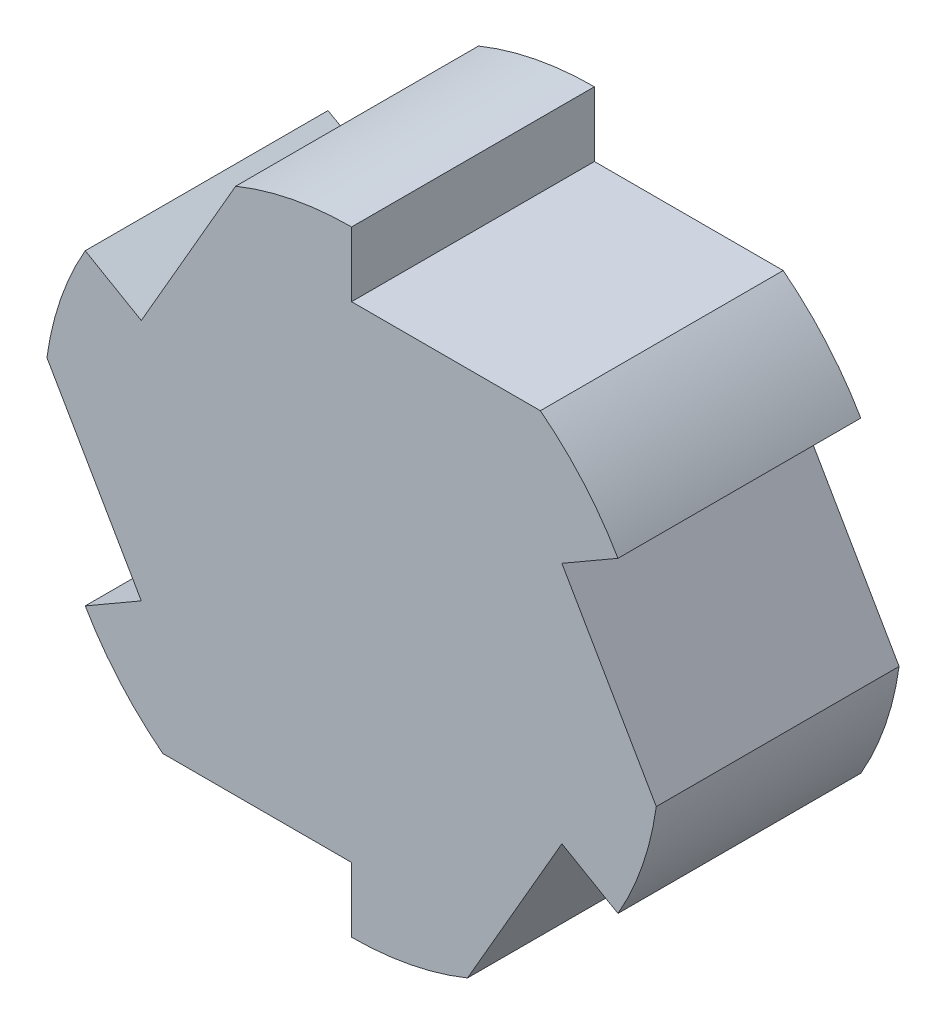
ISO-10303-21;
HEADER;
FILE_DESCRIPTION(('STEP AP214'),'2;1');
FILE_NAME('part.step','',(''),(''),'','','');
FILE_SCHEMA(('AUTOMOTIVE_DESIGN { 1 0 10303 214 1 1 1 1 }'));
ENDSEC;
DATA;
#1=APPLICATION_CONTEXT('core data for automotive mechanical design processes');
#2=APPLICATION_PROTOCOL_DEFINITION('international standard','automotive_design',2000,#1);
#3=PRODUCT_CONTEXT('',#1,'mechanical');
#4=PRODUCT('Part','Part','',(#3));
#5=PRODUCT_RELATED_PRODUCT_CATEGORY('part','',(#4));
#6=PRODUCT_DEFINITION_FORMATION('','',#4);
#7=PRODUCT_DEFINITION_CONTEXT('part definition',#1,'design');
#8=PRODUCT_DEFINITION('design','',#6,#7);
#9=PRODUCT_DEFINITION_SHAPE('','',#8);
#10=(LENGTH_UNIT() NAMED_UNIT(*) SI_UNIT(.MILLI.,.METRE.));
#11=(NAMED_UNIT(*) PLANE_ANGLE_UNIT() SI_UNIT($,.RADIAN.));
#12=(NAMED_UNIT(*) SI_UNIT($,.STERADIAN.) SOLID_ANGLE_UNIT());
#13=UNCERTAINTY_MEASURE_WITH_UNIT(LENGTH_MEASURE(1.E-05),#10,'distance_accuracy_value','');
#14=(GEOMETRIC_REPRESENTATION_CONTEXT(3) GLOBAL_UNCERTAINTY_ASSIGNED_CONTEXT((#13)) GLOBAL_UNIT_ASSIGNED_CONTEXT((#10,
#11,#12)) REPRESENTATION_CONTEXT('',''));
#15=CARTESIAN_POINT('',(0.,0.,0.));
#16=DIRECTION('',(0.,0.,1.));
#17=DIRECTION('',(1.,0.,0.));
#18=AXIS2_PLACEMENT_3D('',#15,#16,#17);
#19=CARTESIAN_POINT('',(0.,0.,30.));
#20=DIRECTION('',(0.,0.,-1.));
#21=DIRECTION('',(-1.,0.,0.));
#22=AXIS2_PLACEMENT_3D('',#19,#20,#21);
#23=CYLINDRICAL_SURFACE('',#22,38.);
#24=CARTESIAN_POINT('',(0.,0.,0.));
#25=DIRECTION('',(0.,0.,1.));
#26=DIRECTION('',(1.,0.,0.));
#27=AXIS2_PLACEMENT_3D('',#24,#25,#26);
#28=CIRCLE('',#27,38.);
#29=CARTESIAN_POINT('',(-14.3188583238421,35.1990098767243,0.));
#30=VERTEX_POINT('',#29);
#31=CARTESIAN_POINT('',(5.27355936696949E-13,38.,0.));
#32=VERTEX_POINT('',#31);
#33=EDGE_CURVE('E192',#30,#32,#28,.F.);
#34=ORIENTED_EDGE('',*,*,#33,.F.);
#35=DIRECTION('',(0.,0.,-1.));
#36=VECTOR('',#35,1.);
#37=CARTESIAN_POINT('',(-14.3188583238421,35.1990098767243,30.));
#38=LINE('',#37,#36);
#39=CARTESIAN_POINT('',(-14.3188583238421,35.1990098767243,30.));
#40=VERTEX_POINT('',#39);
#41=EDGE_CURVE('E11',#40,#30,#38,.T.);
#42=ORIENTED_EDGE('',*,*,#41,.F.);
#43=CARTESIAN_POINT('',(0.,0.,30.));
#44=DIRECTION('',(0.,0.,1.));
#45=DIRECTION('',(1.,0.,0.));
#46=AXIS2_PLACEMENT_3D('',#43,#44,#45);
#47=CIRCLE('',#46,38.);
#48=CARTESIAN_POINT('',(5.27355936696949E-13,38.,30.));
#49=VERTEX_POINT('',#48);
#50=EDGE_CURVE('E242',#40,#49,#47,.F.);
#51=ORIENTED_EDGE('',*,*,#50,.T.);
#52=DIRECTION('',(0.,0.,-1.));
#53=VECTOR('',#52,1.);
#54=CARTESIAN_POINT('',(5.27355936696949E-13,38.,30.));
#55=LINE('',#54,#53);
#56=EDGE_CURVE('E55',#49,#32,#55,.T.);
#57=ORIENTED_EDGE('',*,*,#56,.T.);
#58=EDGE_LOOP('',(#34,#42,#51,#57));
#59=FACE_BOUND('',#58,.T.);
#60=ADVANCED_FACE('F39',(#59),#23,.T.);
#61=CARTESIAN_POINT('',(-25.980762113533,15.0000000000003,30.));
#62=DIRECTION('',(-0.866025403784433,0.50000000000001,0.));
#63=DIRECTION('',(-0.50000000000001,-0.866025403784433,0.));
#64=AXIS2_PLACEMENT_3D('',#61,#62,#63);
#65=PLANE('',#64);
#66=DIRECTION('',(0.50000000000001,0.866025403784433,0.));
#67=VECTOR('',#66,1.);
#68=CARTESIAN_POINT('',(-25.980762113533,15.0000000000003,0.));
#69=LINE('',#68,#67);
#70=CARTESIAN_POINT('',(-25.980762113533,15.0000000000003,0.));
#71=VERTEX_POINT('',#70);
#72=EDGE_CURVE('E194',#71,#30,#69,.T.);
#73=ORIENTED_EDGE('',*,*,#72,.F.);
#74=DIRECTION('',(0.,0.,-1.));
#75=VECTOR('',#74,1.);
#76=CARTESIAN_POINT('',(-25.980762113533,15.0000000000003,30.));
#77=LINE('',#76,#75);
#78=CARTESIAN_POINT('',(-25.980762113533,15.0000000000003,30.));
#79=VERTEX_POINT('',#78);
#80=EDGE_CURVE('E47',#79,#71,#77,.T.);
#81=ORIENTED_EDGE('',*,*,#80,.F.);
#82=DIRECTION('',(0.50000000000001,0.866025403784433,0.));
#83=VECTOR('',#82,1.);
#84=CARTESIAN_POINT('',(-25.980762113533,15.0000000000003,30.));
#85=LINE('',#84,#83);
#86=EDGE_CURVE('E291',#79,#40,#85,.T.);
#87=ORIENTED_EDGE('',*,*,#86,.T.);
#88=ORIENTED_EDGE('',*,*,#41,.T.);
#89=EDGE_LOOP('',(#73,#81,#87,#88));
#90=FACE_BOUND('',#89,.T.);
#91=ADVANCED_FACE('F279',(#90),#65,.T.);
#92=CARTESIAN_POINT('',(0.,0.,30.));
#93=DIRECTION('',(0.50000000000001,0.866025403784433,0.));
#94=DIRECTION('',(-0.866025403784433,0.50000000000001,0.));
#95=AXIS2_PLACEMENT_3D('',#92,#93,#94);
#96=PLANE('',#95);
#97=DIRECTION('',(0.866025403784433,-0.50000000000001,0.));
#98=VECTOR('',#97,1.);
#99=CARTESIAN_POINT('',(0.,0.,0.));
#100=LINE('',#99,#98);
#101=CARTESIAN_POINT('',(-32.9089653438085,19.0000000000004,0.));
#102=VERTEX_POINT('',#101);
#103=EDGE_CURVE('E197',#102,#71,#100,.T.);
#104=ORIENTED_EDGE('',*,*,#103,.F.);
#105=DIRECTION('',(0.,0.,-1.));
#106=VECTOR('',#105,1.);
#107=CARTESIAN_POINT('',(-32.9089653438085,19.0000000000004,30.));
#108=LINE('',#107,#106);
#109=CARTESIAN_POINT('',(-32.9089653438085,19.0000000000004,30.));
#110=VERTEX_POINT('',#109);
#111=EDGE_CURVE('E268',#110,#102,#108,.T.);
#112=ORIENTED_EDGE('',*,*,#111,.F.);
#113=DIRECTION('',(0.866025403784433,-0.50000000000001,0.));
#114=VECTOR('',#113,1.);
#115=CARTESIAN_POINT('',(0.,0.,30.));
#116=LINE('',#115,#114);
#117=EDGE_CURVE('E275',#110,#79,#116,.T.);
#118=ORIENTED_EDGE('',*,*,#117,.T.);
#119=ORIENTED_EDGE('',*,*,#80,.T.);
#120=EDGE_LOOP('',(#104,#112,#118,#119));
#121=FACE_BOUND('',#120,.T.);
#122=ADVANCED_FACE('F273',(#121),#96,.T.);
#123=CARTESIAN_POINT('',(0.,0.,30.));
#124=DIRECTION('',(0.,0.,-1.));
#125=DIRECTION('',(-1.,0.,0.));
#126=AXIS2_PLACEMENT_3D('',#123,#124,#125);
#127=CYLINDRICAL_SURFACE('',#126,38.);
#128=CARTESIAN_POINT('',(0.,0.,0.));
#129=DIRECTION('',(0.,0.,1.));
#130=DIRECTION('',(1.,0.,0.));
#131=AXIS2_PLACEMENT_3D('',#128,#129,#130);
#132=CIRCLE('',#131,38.);
#133=CARTESIAN_POINT('',(-37.6426659032237,5.19900987672452,0.));
#134=VERTEX_POINT('',#133);
#135=EDGE_CURVE('E200',#134,#102,#132,.F.);
#136=ORIENTED_EDGE('',*,*,#135,.F.);
#137=DIRECTION('',(0.,0.,-1.));
#138=VECTOR('',#137,1.);
#139=CARTESIAN_POINT('',(-37.6426659032237,5.19900987672452,30.));
#140=LINE('',#139,#138);
#141=CARTESIAN_POINT('',(-37.6426659032237,5.19900987672452,30.));
#142=VERTEX_POINT('',#141);
#143=EDGE_CURVE('E266',#142,#134,#140,.T.);
#144=ORIENTED_EDGE('',*,*,#143,.F.);
#145=CARTESIAN_POINT('',(0.,0.,30.));
#146=DIRECTION('',(0.,0.,1.));
#147=DIRECTION('',(1.,0.,0.));
#148=AXIS2_PLACEMENT_3D('',#145,#146,#147);
#149=CIRCLE('',#148,38.);
#150=EDGE_CURVE('E288',#142,#110,#149,.F.);
#151=ORIENTED_EDGE('',*,*,#150,.T.);
#152=ORIENTED_EDGE('',*,*,#111,.T.);
#153=EDGE_LOOP('',(#136,#144,#151,#152));
#154=FACE_BOUND('',#153,.T.);
#155=ADVANCED_FACE('F285',(#154),#127,.T.);
#156=CARTESIAN_POINT('',(-25.9807621135333,-14.9999999999998,30.));
#157=DIRECTION('',(-0.866025403784443,-0.499999999999992,0.));
#158=DIRECTION('',(0.499999999999992,-0.866025403784443,0.));
#159=AXIS2_PLACEMENT_3D('',#156,#157,#158);
#160=PLANE('',#159);
#161=DIRECTION('',(-0.499999999999992,0.866025403784443,0.));
#162=VECTOR('',#161,1.);
#163=CARTESIAN_POINT('',(-25.9807621135333,-14.9999999999998,0.));
#164=LINE('',#163,#162);
#165=CARTESIAN_POINT('',(-25.9807621135333,-14.9999999999998,0.));
#166=VERTEX_POINT('',#165);
#167=EDGE_CURVE('E203',#166,#134,#164,.T.);
#168=ORIENTED_EDGE('',*,*,#167,.F.);
#169=DIRECTION('',(0.,0.,-1.));
#170=VECTOR('',#169,1.);
#171=CARTESIAN_POINT('',(-25.9807621135333,-14.9999999999998,30.));
#172=LINE('',#171,#170);
#173=CARTESIAN_POINT('',(-25.9807621135333,-14.9999999999998,30.));
#174=VERTEX_POINT('',#173);
#175=EDGE_CURVE('E264',#174,#166,#172,.T.);
#176=ORIENTED_EDGE('',*,*,#175,.F.);
#177=DIRECTION('',(-0.499999999999992,0.866025403784443,0.));
#178=VECTOR('',#177,1.);
#179=CARTESIAN_POINT('',(-25.9807621135333,-14.9999999999998,30.));
#180=LINE('',#179,#178);
#181=EDGE_CURVE('E293',#174,#142,#180,.T.);
#182=ORIENTED_EDGE('',*,*,#181,.T.);
#183=ORIENTED_EDGE('',*,*,#143,.T.);
#184=EDGE_LOOP('',(#168,#176,#182,#183));
#185=FACE_BOUND('',#184,.T.);
#186=ADVANCED_FACE('F350',(#185),#160,.T.);
#187=CARTESIAN_POINT('',(0.,0.,30.));
#188=DIRECTION('',(-0.499999999999992,0.866025403784443,0.));
#189=DIRECTION('',(-0.866025403784443,-0.499999999999992,0.));
#190=AXIS2_PLACEMENT_3D('',#187,#188,#189);
#191=PLANE('',#190);
#192=DIRECTION('',(0.866025403784443,0.499999999999992,0.));
#193=VECTOR('',#192,1.);
#194=CARTESIAN_POINT('',(0.,0.,0.));
#195=LINE('',#194,#193);
#196=CARTESIAN_POINT('',(-32.9089653438088,-18.9999999999997,0.));
#197=VERTEX_POINT('',#196);
#198=EDGE_CURVE('E206',#197,#166,#195,.T.);
#199=ORIENTED_EDGE('',*,*,#198,.F.);
#200=DIRECTION('',(0.,0.,-1.));
#201=VECTOR('',#200,1.);
#202=CARTESIAN_POINT('',(-32.9089653438088,-18.9999999999997,30.));
#203=LINE('',#202,#201);
#204=CARTESIAN_POINT('',(-32.9089653438088,-18.9999999999997,30.));
#205=VERTEX_POINT('',#204);
#206=EDGE_CURVE('E262',#205,#197,#203,.T.);
#207=ORIENTED_EDGE('',*,*,#206,.F.);
#208=DIRECTION('',(0.866025403784443,0.499999999999992,0.));
#209=VECTOR('',#208,1.);
#210=CARTESIAN_POINT('',(0.,0.,30.));
#211=LINE('',#210,#209);
#212=EDGE_CURVE('E299',#205,#174,#211,.T.);
#213=ORIENTED_EDGE('',*,*,#212,.T.);
#214=ORIENTED_EDGE('',*,*,#175,.T.);
#215=EDGE_LOOP('',(#199,#207,#213,#214));
#216=FACE_BOUND('',#215,.T.);
#217=ADVANCED_FACE('F353',(#216),#191,.T.);
#218=CARTESIAN_POINT('',(0.,0.,30.));
#219=DIRECTION('',(0.,0.,-1.));
#220=DIRECTION('',(-1.,0.,0.));
#221=AXIS2_PLACEMENT_3D('',#218,#219,#220);
#222=CYLINDRICAL_SURFACE('',#221,38.);
#223=CARTESIAN_POINT('',(0.,0.,0.));
#224=DIRECTION('',(0.,0.,1.));
#225=DIRECTION('',(1.,0.,0.));
#226=AXIS2_PLACEMENT_3D('',#223,#224,#225);
#227=CIRCLE('',#226,38.);
#228=CARTESIAN_POINT('',(-23.3238075793814,-29.9999999999998,0.));
#229=VERTEX_POINT('',#228);
#230=EDGE_CURVE('E209',#229,#197,#227,.F.);
#231=ORIENTED_EDGE('',*,*,#230,.F.);
#232=DIRECTION('',(0.,0.,-1.));
#233=VECTOR('',#232,1.);
#234=CARTESIAN_POINT('',(-23.3238075793814,-29.9999999999998,30.));
#235=LINE('',#234,#233);
#236=CARTESIAN_POINT('',(-23.3238075793814,-29.9999999999998,30.));
#237=VERTEX_POINT('',#236);
#238=EDGE_CURVE('E260',#237,#229,#235,.T.);
#239=ORIENTED_EDGE('',*,*,#238,.F.);
#240=CARTESIAN_POINT('',(0.,0.,30.));
#241=DIRECTION('',(0.,0.,1.));
#242=DIRECTION('',(1.,0.,0.));
#243=AXIS2_PLACEMENT_3D('',#240,#241,#242);
#244=CIRCLE('',#243,38.);
#245=EDGE_CURVE('E302',#237,#205,#244,.F.);
#246=ORIENTED_EDGE('',*,*,#245,.T.);
#247=ORIENTED_EDGE('',*,*,#206,.T.);
#248=EDGE_LOOP('',(#231,#239,#246,#247));
#249=FACE_BOUND('',#248,.T.);
#250=ADVANCED_FACE('F357',(#249),#222,.T.);
#251=CARTESIAN_POINT('',(-1.96351730350721E-13,-30.,30.));
#252=DIRECTION('',(0.,-1.,0.));
#253=DIRECTION('',(1.,0.,0.));
#254=AXIS2_PLACEMENT_3D('',#251,#252,#253);
#255=PLANE('',#254);
#256=DIRECTION('',(-1.,0.,0.));
#257=VECTOR('',#256,1.);
#258=CARTESIAN_POINT('',(-1.96351730350721E-13,-30.,0.));
#259=LINE('',#258,#257);
#260=CARTESIAN_POINT('',(-1.95156391047391E-13,-30.,0.));
#261=VERTEX_POINT('',#260);
#262=EDGE_CURVE('E212',#261,#229,#259,.T.);
#263=ORIENTED_EDGE('',*,*,#262,.F.);
#264=DIRECTION('',(0.,0.,-1.));
#265=VECTOR('',#264,1.);
#266=CARTESIAN_POINT('',(-1.95156391047391E-13,-30.,30.));
#267=LINE('',#266,#265);
#268=CARTESIAN_POINT('',(-1.95156391047391E-13,-30.,30.));
#269=VERTEX_POINT('',#268);
#270=EDGE_CURVE('E258',#269,#261,#267,.T.);
#271=ORIENTED_EDGE('',*,*,#270,.F.);
#272=DIRECTION('',(-1.,0.,0.));
#273=VECTOR('',#272,1.);
#274=CARTESIAN_POINT('',(-1.96351730350721E-13,-30.,30.));
#275=LINE('',#274,#273);
#276=EDGE_CURVE('E305',#269,#237,#275,.T.);
#277=ORIENTED_EDGE('',*,*,#276,.T.);
#278=ORIENTED_EDGE('',*,*,#238,.T.);
#279=EDGE_LOOP('',(#263,#271,#277,#278));
#280=FACE_BOUND('',#279,.T.);
#281=ADVANCED_FACE('F361',(#280),#255,.T.);
#282=CARTESIAN_POINT('',(0.,0.,30.));
#283=DIRECTION('',(-1.,0.,0.));
#284=DIRECTION('',(0.,-1.,0.));
#285=AXIS2_PLACEMENT_3D('',#282,#283,#284);
#286=PLANE('',#285);
#287=DIRECTION('',(0.,1.,0.));
#288=VECTOR('',#287,1.);
#289=CARTESIAN_POINT('',(0.,0.,0.));
#290=LINE('',#289,#288);
#291=CARTESIAN_POINT('',(-2.47198095326695E-13,-38.,0.));
#292=VERTEX_POINT('',#291);
#293=EDGE_CURVE('E215',#292,#261,#290,.T.);
#294=ORIENTED_EDGE('',*,*,#293,.F.);
#295=DIRECTION('',(0.,0.,-1.));
#296=VECTOR('',#295,1.);
#297=CARTESIAN_POINT('',(-2.47198095326695E-13,-38.,30.));
#298=LINE('',#297,#296);
#299=CARTESIAN_POINT('',(-2.47198095326695E-13,-38.,30.));
#300=VERTEX_POINT('',#299);
#301=EDGE_CURVE('E256',#300,#292,#298,.T.);
#302=ORIENTED_EDGE('',*,*,#301,.F.);
#303=DIRECTION('',(0.,1.,0.));
#304=VECTOR('',#303,1.);
#305=CARTESIAN_POINT('',(0.,0.,30.));
#306=LINE('',#305,#304);
#307=EDGE_CURVE('E308',#300,#269,#306,.T.);
#308=ORIENTED_EDGE('',*,*,#307,.T.);
#309=ORIENTED_EDGE('',*,*,#270,.T.);
#310=EDGE_LOOP('',(#294,#302,#308,#309));
#311=FACE_BOUND('',#310,.T.);
#312=ADVANCED_FACE('F365',(#311),#286,.T.);
#313=CARTESIAN_POINT('',(0.,0.,30.));
#314=DIRECTION('',(0.,0.,-1.));
#315=DIRECTION('',(-1.,0.,0.));
#316=AXIS2_PLACEMENT_3D('',#313,#314,#315);
#317=CYLINDRICAL_SURFACE('',#316,38.);
#318=CARTESIAN_POINT('',(0.,0.,0.));
#319=DIRECTION('',(0.,0.,1.));
#320=DIRECTION('',(1.,0.,0.));
#321=AXIS2_PLACEMENT_3D('',#318,#319,#320);
#322=CIRCLE('',#321,38.);
#323=CARTESIAN_POINT('',(14.3188583238424,-35.1990098767242,0.));
#324=VERTEX_POINT('',#323);
#325=EDGE_CURVE('E218',#324,#292,#322,.F.);
#326=ORIENTED_EDGE('',*,*,#325,.F.);
#327=DIRECTION('',(0.,0.,-1.));
#328=VECTOR('',#327,1.);
#329=CARTESIAN_POINT('',(14.3188583238424,-35.1990098767242,30.));
#330=LINE('',#329,#328);
#331=CARTESIAN_POINT('',(14.3188583238424,-35.1990098767242,30.));
#332=VERTEX_POINT('',#331);
#333=EDGE_CURVE('E254',#332,#324,#330,.T.);
#334=ORIENTED_EDGE('',*,*,#333,.F.);
#335=CARTESIAN_POINT('',(0.,0.,30.));
#336=DIRECTION('',(0.,0.,1.));
#337=DIRECTION('',(1.,0.,0.));
#338=AXIS2_PLACEMENT_3D('',#335,#336,#337);
#339=CIRCLE('',#338,38.);
#340=EDGE_CURVE('E311',#332,#300,#339,.F.);
#341=ORIENTED_EDGE('',*,*,#340,.T.);
#342=ORIENTED_EDGE('',*,*,#301,.T.);
#343=EDGE_LOOP('',(#326,#334,#341,#342));
#344=FACE_BOUND('',#343,.T.);
#345=ADVANCED_FACE('F369',(#344),#317,.T.);
#346=CARTESIAN_POINT('',(25.9807621135331,-15.0000000000001,30.));
#347=DIRECTION('',(0.866025403784436,-0.500000000000004,0.));
#348=DIRECTION('',(0.500000000000004,0.866025403784436,0.));
#349=AXIS2_PLACEMENT_3D('',#346,#347,#348);
#350=PLANE('',#349);
#351=DIRECTION('',(-0.500000000000004,-0.866025403784436,0.));
#352=VECTOR('',#351,1.);
#353=CARTESIAN_POINT('',(25.9807621135331,-15.0000000000001,0.));
#354=LINE('',#353,#352);
#355=CARTESIAN_POINT('',(25.9807621135331,-15.0000000000001,0.));
#356=VERTEX_POINT('',#355);
#357=EDGE_CURVE('E221',#356,#324,#354,.T.);
#358=ORIENTED_EDGE('',*,*,#357,.F.);
#359=DIRECTION('',(0.,0.,-1.));
#360=VECTOR('',#359,1.);
#361=CARTESIAN_POINT('',(25.9807621135331,-15.0000000000001,30.));
#362=LINE('',#361,#360);
#363=CARTESIAN_POINT('',(25.9807621135331,-15.0000000000001,30.));
#364=VERTEX_POINT('',#363);
#365=EDGE_CURVE('E252',#364,#356,#362,.T.);
#366=ORIENTED_EDGE('',*,*,#365,.F.);
#367=DIRECTION('',(-0.500000000000004,-0.866025403784436,0.));
#368=VECTOR('',#367,1.);
#369=CARTESIAN_POINT('',(25.9807621135331,-15.0000000000001,30.));
#370=LINE('',#369,#368);
#371=EDGE_CURVE('E314',#364,#332,#370,.T.);
#372=ORIENTED_EDGE('',*,*,#371,.T.);
#373=ORIENTED_EDGE('',*,*,#333,.T.);
#374=EDGE_LOOP('',(#358,#366,#372,#373));
#375=FACE_BOUND('',#374,.T.);
#376=ADVANCED_FACE('F373',(#375),#350,.T.);
#377=CARTESIAN_POINT('',(0.,0.,30.));
#378=DIRECTION('',(-0.500000000000004,-0.866025403784436,0.));
#379=DIRECTION('',(0.866025403784436,-0.500000000000004,0.));
#380=AXIS2_PLACEMENT_3D('',#377,#378,#379);
#381=PLANE('',#380);
#382=DIRECTION('',(-0.866025403784436,0.500000000000004,0.));
#383=VECTOR('',#382,1.);
#384=CARTESIAN_POINT('',(0.,0.,0.));
#385=LINE('',#384,#383);
#386=CARTESIAN_POINT('',(32.9089653438086,-19.0000000000002,0.));
#387=VERTEX_POINT('',#386);
#388=EDGE_CURVE('E224',#387,#356,#385,.T.);
#389=ORIENTED_EDGE('',*,*,#388,.F.);
#390=DIRECTION('',(0.,0.,-1.));
#391=VECTOR('',#390,1.);
#392=CARTESIAN_POINT('',(32.9089653438086,-19.0000000000002,30.));
#393=LINE('',#392,#391);
#394=CARTESIAN_POINT('',(32.9089653438086,-19.0000000000002,30.));
#395=VERTEX_POINT('',#394);
#396=EDGE_CURVE('E250',#395,#387,#393,.T.);
#397=ORIENTED_EDGE('',*,*,#396,.F.);
#398=DIRECTION('',(-0.866025403784436,0.500000000000004,0.));
#399=VECTOR('',#398,1.);
#400=CARTESIAN_POINT('',(0.,0.,30.));
#401=LINE('',#400,#399);
#402=EDGE_CURVE('E317',#395,#364,#401,.T.);
#403=ORIENTED_EDGE('',*,*,#402,.T.);
#404=ORIENTED_EDGE('',*,*,#365,.T.);
#405=EDGE_LOOP('',(#389,#397,#403,#404));
#406=FACE_BOUND('',#405,.T.);
#407=ADVANCED_FACE('F377',(#406),#381,.T.);
#408=CARTESIAN_POINT('',(0.,0.,30.));
#409=DIRECTION('',(0.,0.,-1.));
#410=DIRECTION('',(-1.,0.,0.));
#411=AXIS2_PLACEMENT_3D('',#408,#409,#410);
#412=CYLINDRICAL_SURFACE('',#411,38.);
#413=CARTESIAN_POINT('',(0.,0.,0.));
#414=DIRECTION('',(0.,0.,1.));
#415=DIRECTION('',(1.,0.,0.));
#416=AXIS2_PLACEMENT_3D('',#413,#414,#415);
#417=CIRCLE('',#416,38.);
#418=CARTESIAN_POINT('',(37.6426659032238,-5.19900987672425,0.));
#419=VERTEX_POINT('',#418);
#420=EDGE_CURVE('E227',#419,#387,#417,.F.);
#421=ORIENTED_EDGE('',*,*,#420,.F.);
#422=DIRECTION('',(0.,0.,-1.));
#423=VECTOR('',#422,1.);
#424=CARTESIAN_POINT('',(37.6426659032238,-5.19900987672425,30.));
#425=LINE('',#424,#423);
#426=CARTESIAN_POINT('',(37.6426659032238,-5.19900987672425,30.));
#427=VERTEX_POINT('',#426);
#428=EDGE_CURVE('E248',#427,#419,#425,.T.);
#429=ORIENTED_EDGE('',*,*,#428,.F.);
#430=CARTESIAN_POINT('',(0.,0.,30.));
#431=DIRECTION('',(0.,0.,1.));
#432=DIRECTION('',(1.,0.,0.));
#433=AXIS2_PLACEMENT_3D('',#430,#431,#432);
#434=CIRCLE('',#433,38.);
#435=EDGE_CURVE('E320',#427,#395,#434,.F.);
#436=ORIENTED_EDGE('',*,*,#435,.T.);
#437=ORIENTED_EDGE('',*,*,#396,.T.);
#438=EDGE_LOOP('',(#421,#429,#436,#437));
#439=FACE_BOUND('',#438,.T.);
#440=ADVANCED_FACE('F381',(#439),#412,.T.);
#441=CARTESIAN_POINT('',(25.9807621135332,14.9999999999999,30.));
#442=DIRECTION('',(0.86602540378444,0.499999999999998,0.));
#443=DIRECTION('',(-0.499999999999998,0.86602540378444,0.));
#444=AXIS2_PLACEMENT_3D('',#441,#442,#443);
#445=PLANE('',#444);
#446=DIRECTION('',(0.499999999999998,-0.86602540378444,0.));
#447=VECTOR('',#446,1.);
#448=CARTESIAN_POINT('',(25.9807621135332,14.9999999999999,0.));
#449=LINE('',#448,#447);
#450=CARTESIAN_POINT('',(25.9807621135332,14.9999999999999,0.));
#451=VERTEX_POINT('',#450);
#452=EDGE_CURVE('E230',#451,#419,#449,.T.);
#453=ORIENTED_EDGE('',*,*,#452,.F.);
#454=DIRECTION('',(0.,0.,-1.));
#455=VECTOR('',#454,1.);
#456=CARTESIAN_POINT('',(25.9807621135332,14.9999999999999,30.));
#457=LINE('',#456,#455);
#458=CARTESIAN_POINT('',(25.9807621135332,14.9999999999999,30.));
#459=VERTEX_POINT('',#458);
#460=EDGE_CURVE('E246',#459,#451,#457,.T.);
#461=ORIENTED_EDGE('',*,*,#460,.F.);
#462=DIRECTION('',(0.499999999999998,-0.86602540378444,0.));
#463=VECTOR('',#462,1.);
#464=CARTESIAN_POINT('',(25.9807621135332,14.9999999999999,30.));
#465=LINE('',#464,#463);
#466=EDGE_CURVE('E323',#459,#427,#465,.T.);
#467=ORIENTED_EDGE('',*,*,#466,.T.);
#468=ORIENTED_EDGE('',*,*,#428,.T.);
#469=EDGE_LOOP('',(#453,#461,#467,#468));
#470=FACE_BOUND('',#469,.T.);
#471=ADVANCED_FACE('F385',(#470),#445,.T.);
#472=CARTESIAN_POINT('',(0.,0.,30.));
#473=DIRECTION('',(0.499999999999998,-0.86602540378444,0.));
#474=DIRECTION('',(0.86602540378444,0.499999999999998,0.));
#475=AXIS2_PLACEMENT_3D('',#472,#473,#474);
#476=PLANE('',#475);
#477=DIRECTION('',(-0.86602540378444,-0.499999999999998,0.));
#478=VECTOR('',#477,1.);
#479=CARTESIAN_POINT('',(0.,0.,0.));
#480=LINE('',#479,#478);
#481=CARTESIAN_POINT('',(32.9089653438087,18.9999999999999,0.));
#482=VERTEX_POINT('',#481);
#483=EDGE_CURVE('E233',#482,#451,#480,.T.);
#484=ORIENTED_EDGE('',*,*,#483,.F.);
#485=DIRECTION('',(0.,0.,-1.));
#486=VECTOR('',#485,1.);
#487=CARTESIAN_POINT('',(32.9089653438087,18.9999999999999,30.));
#488=LINE('',#487,#486);
#489=CARTESIAN_POINT('',(32.9089653438087,18.9999999999999,30.));
#490=VERTEX_POINT('',#489);
#491=EDGE_CURVE('E174',#490,#482,#488,.T.);
#492=ORIENTED_EDGE('',*,*,#491,.F.);
#493=DIRECTION('',(-0.86602540378444,-0.499999999999998,0.));
#494=VECTOR('',#493,1.);
#495=CARTESIAN_POINT('',(0.,0.,30.));
#496=LINE('',#495,#494);
#497=EDGE_CURVE('E184',#490,#459,#496,.T.);
#498=ORIENTED_EDGE('',*,*,#497,.T.);
#499=ORIENTED_EDGE('',*,*,#460,.T.);
#500=EDGE_LOOP('',(#484,#492,#498,#499));
#501=FACE_BOUND('',#500,.T.);
#502=ADVANCED_FACE('F327',(#501),#476,.T.);
#503=CARTESIAN_POINT('',(0.,0.,30.));
#504=DIRECTION('',(0.,0.,-1.));
#505=DIRECTION('',(-1.,0.,0.));
#506=AXIS2_PLACEMENT_3D('',#503,#504,#505);
#507=CYLINDRICAL_SURFACE('',#506,38.);
#508=CARTESIAN_POINT('',(0.,0.,0.));
#509=DIRECTION('',(0.,0.,1.));
#510=DIRECTION('',(1.,0.,0.));
#511=AXIS2_PLACEMENT_3D('',#508,#509,#510);
#512=CIRCLE('',#511,38.);
#513=CARTESIAN_POINT('',(23.3238075793812,30.,0.));
#514=VERTEX_POINT('',#513);
#515=EDGE_CURVE('E170',#514,#482,#512,.F.);
#516=ORIENTED_EDGE('',*,*,#515,.F.);
#517=DIRECTION('',(0.,0.,-1.));
#518=VECTOR('',#517,1.);
#519=CARTESIAN_POINT('',(23.3238075793812,30.,30.));
#520=LINE('',#519,#518);
#521=CARTESIAN_POINT('',(23.3238075793812,30.,30.));
#522=VERTEX_POINT('',#521);
#523=EDGE_CURVE('E165',#522,#514,#520,.T.);
#524=ORIENTED_EDGE('',*,*,#523,.F.);
#525=CARTESIAN_POINT('',(0.,0.,30.));
#526=DIRECTION('',(0.,0.,1.));
#527=DIRECTION('',(1.,0.,0.));
#528=AXIS2_PLACEMENT_3D('',#525,#526,#527);
#529=CIRCLE('',#528,38.);
#530=EDGE_CURVE('E168',#522,#490,#529,.F.);
#531=ORIENTED_EDGE('',*,*,#530,.T.);
#532=ORIENTED_EDGE('',*,*,#491,.T.);
#533=EDGE_LOOP('',(#516,#524,#531,#532));
#534=FACE_BOUND('',#533,.T.);
#535=ADVANCED_FACE('F167',(#534),#507,.T.);
#536=CARTESIAN_POINT('',(0.,30.,30.));
#537=DIRECTION('',(0.,1.,0.));
#538=DIRECTION('',(0.,0.,1.));
#539=AXIS2_PLACEMENT_3D('',#536,#537,#538);
#540=PLANE('',#539);
#541=DIRECTION('',(1.,0.,0.));
#542=VECTOR('',#541,1.);
#543=CARTESIAN_POINT('',(0.,30.,0.));
#544=LINE('',#543,#542);
#545=CARTESIAN_POINT('',(0.,30.,0.));
#546=VERTEX_POINT('',#545);
#547=EDGE_CURVE('E237',#546,#514,#544,.T.);
#548=ORIENTED_EDGE('',*,*,#547,.F.);
#549=DIRECTION('',(0.,0.,-1.));
#550=VECTOR('',#549,1.);
#551=CARTESIAN_POINT('',(0.,30.,30.));
#552=LINE('',#551,#550);
#553=CARTESIAN_POINT('',(0.,30.,30.));
#554=VERTEX_POINT('',#553);
#555=EDGE_CURVE('E110',#554,#546,#552,.T.);
#556=ORIENTED_EDGE('',*,*,#555,.F.);
#557=DIRECTION('',(1.,0.,0.));
#558=VECTOR('',#557,1.);
#559=CARTESIAN_POINT('',(0.,30.,30.));
#560=LINE('',#559,#558);
#561=EDGE_CURVE('E181',#554,#522,#560,.T.);
#562=ORIENTED_EDGE('',*,*,#561,.T.);
#563=ORIENTED_EDGE('',*,*,#523,.T.);
#564=EDGE_LOOP('',(#548,#556,#562,#563));
#565=FACE_BOUND('',#564,.T.);
#566=ADVANCED_FACE('F186',(#565),#540,.T.);
#567=CARTESIAN_POINT('',(0.,0.,30.));
#568=DIRECTION('',(1.,0.,0.));
#569=DIRECTION('',(0.,1.,0.));
#570=AXIS2_PLACEMENT_3D('',#567,#568,#569);
#571=PLANE('',#570);
#572=DIRECTION('',(0.,-1.,0.));
#573=VECTOR('',#572,1.);
#574=CARTESIAN_POINT('',(0.,0.,0.));
#575=LINE('',#574,#573);
#576=EDGE_CURVE('E239',#32,#546,#575,.T.);
#577=ORIENTED_EDGE('',*,*,#576,.F.);
#578=ORIENTED_EDGE('',*,*,#56,.F.);
#579=DIRECTION('',(0.,-1.,0.));
#580=VECTOR('',#579,1.);
#581=CARTESIAN_POINT('',(0.,0.,30.));
#582=LINE('',#581,#580);
#583=EDGE_CURVE('E187',#49,#554,#582,.T.);
#584=ORIENTED_EDGE('',*,*,#583,.T.);
#585=ORIENTED_EDGE('',*,*,#555,.T.);
#586=EDGE_LOOP('',(#577,#578,#584,#585));
#587=FACE_BOUND('',#586,.T.);
#588=ADVANCED_FACE('F329',(#587),#571,.T.);
#589=CARTESIAN_POINT('',(0.,0.,30.));
#590=DIRECTION('',(0.,0.,1.));
#591=DIRECTION('',(1.,0.,0.));
#592=AXIS2_PLACEMENT_3D('',#589,#590,#591);
#593=PLANE('',#592);
#594=ORIENTED_EDGE('',*,*,#50,.F.);
#595=ORIENTED_EDGE('',*,*,#86,.F.);
#596=ORIENTED_EDGE('',*,*,#117,.F.);
#597=ORIENTED_EDGE('',*,*,#150,.F.);
#598=ORIENTED_EDGE('',*,*,#181,.F.);
#599=ORIENTED_EDGE('',*,*,#212,.F.);
#600=ORIENTED_EDGE('',*,*,#245,.F.);
#601=ORIENTED_EDGE('',*,*,#276,.F.);
#602=ORIENTED_EDGE('',*,*,#307,.F.);
#603=ORIENTED_EDGE('',*,*,#340,.F.);
#604=ORIENTED_EDGE('',*,*,#371,.F.);
#605=ORIENTED_EDGE('',*,*,#402,.F.);
#606=ORIENTED_EDGE('',*,*,#435,.F.);
#607=ORIENTED_EDGE('',*,*,#466,.F.);
#608=ORIENTED_EDGE('',*,*,#497,.F.);
#609=ORIENTED_EDGE('',*,*,#530,.F.);
#610=ORIENTED_EDGE('',*,*,#561,.F.);
#611=ORIENTED_EDGE('',*,*,#583,.F.);
#612=EDGE_LOOP('',(#594,#595,#596,#597,#598,#599,#600,#601,#602,#603,#604,#605,#606,#607,#608,
#609,#610,#611));
#613=FACE_BOUND('',#612,.T.);
#614=ADVANCED_FACE('F179',(#613),#593,.T.);
#615=CARTESIAN_POINT('',(0.,0.,0.));
#616=DIRECTION('',(0.,0.,1.));
#617=DIRECTION('',(1.,0.,0.));
#618=AXIS2_PLACEMENT_3D('',#615,#616,#617);
#619=PLANE('',#618);
#620=ORIENTED_EDGE('',*,*,#33,.T.);
#621=ORIENTED_EDGE('',*,*,#576,.T.);
#622=ORIENTED_EDGE('',*,*,#547,.T.);
#623=ORIENTED_EDGE('',*,*,#515,.T.);
#624=ORIENTED_EDGE('',*,*,#483,.T.);
#625=ORIENTED_EDGE('',*,*,#452,.T.);
#626=ORIENTED_EDGE('',*,*,#420,.T.);
#627=ORIENTED_EDGE('',*,*,#388,.T.);
#628=ORIENTED_EDGE('',*,*,#357,.T.);
#629=ORIENTED_EDGE('',*,*,#325,.T.);
#630=ORIENTED_EDGE('',*,*,#293,.T.);
#631=ORIENTED_EDGE('',*,*,#262,.T.);
#632=ORIENTED_EDGE('',*,*,#230,.T.);
#633=ORIENTED_EDGE('',*,*,#198,.T.);
#634=ORIENTED_EDGE('',*,*,#167,.T.);
#635=ORIENTED_EDGE('',*,*,#135,.T.);
#636=ORIENTED_EDGE('',*,*,#103,.T.);
#637=ORIENTED_EDGE('',*,*,#72,.T.);
#638=EDGE_LOOP('',(#620,#621,#622,#623,#624,#625,#626,#627,#628,#629,#630,#631,#632,#633,#634,
#635,#636,#637));
#639=FACE_BOUND('',#638,.T.);
#640=ADVANCED_FACE('F281',(#639),#619,.F.);
#641=CLOSED_SHELL('',(#60,#91,#122,#155,#186,#217,#250,#281,#312,#345,#376,#407,#440,#471,#502,
#535,#566,#588,#614,#640));
#642=MANIFOLD_SOLID_BREP('B2',#641);
#643=ADVANCED_BREP_SHAPE_REPRESENTATION('',(#18,#642),#14);
#644=SHAPE_DEFINITION_REPRESENTATION(#9,#643);
ENDSEC;
END-ISO-10303-21;
